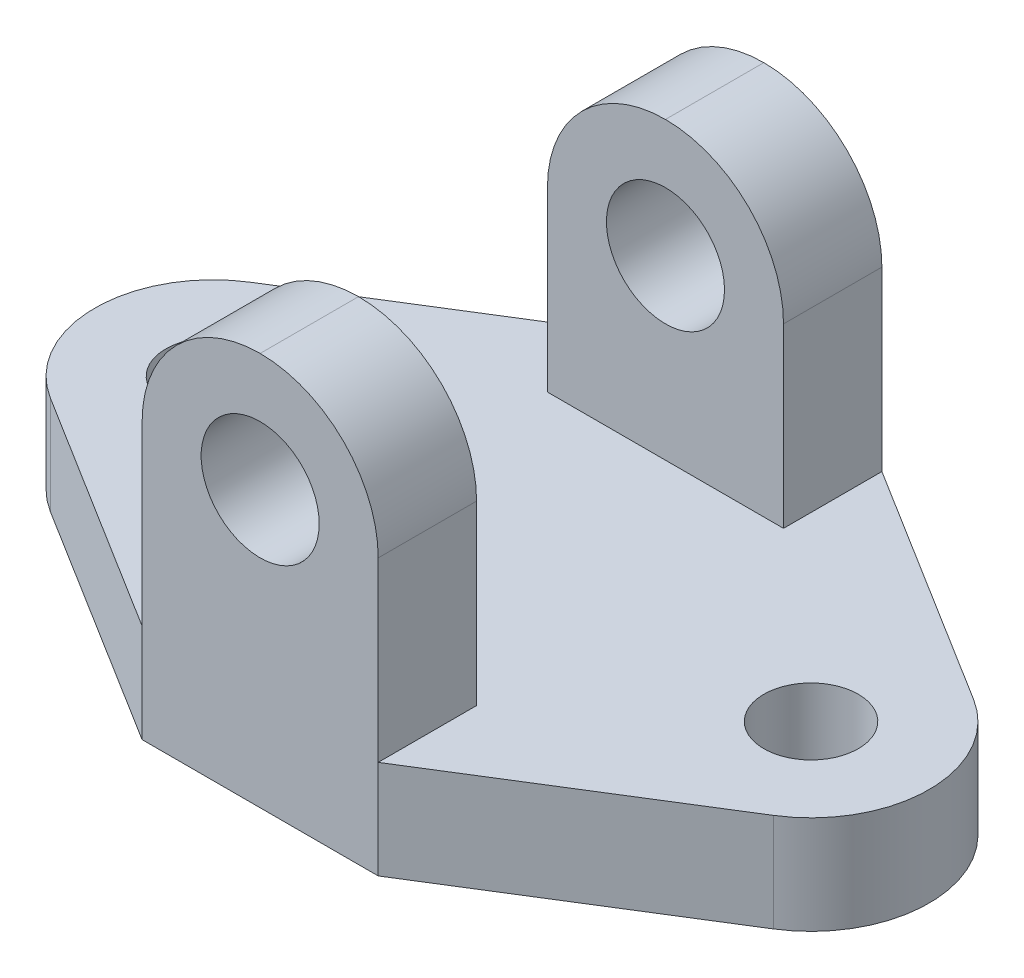
ISO-10303-21;
HEADER;
FILE_DESCRIPTION(('STEP AP214'),'2;1');
FILE_NAME('part.step','',(''),(''),'','','');
FILE_SCHEMA(('AUTOMOTIVE_DESIGN { 1 0 10303 214 1 1 1 1 }'));
ENDSEC;
DATA;
#1=APPLICATION_CONTEXT('core data for automotive mechanical design processes');
#2=APPLICATION_PROTOCOL_DEFINITION('international standard','automotive_design',2000,#1);
#3=PRODUCT_CONTEXT('',#1,'mechanical');
#4=PRODUCT('Part','Part','',(#3));
#5=PRODUCT_RELATED_PRODUCT_CATEGORY('part','',(#4));
#6=PRODUCT_DEFINITION_FORMATION('','',#4);
#7=PRODUCT_DEFINITION_CONTEXT('part definition',#1,'design');
#8=PRODUCT_DEFINITION('design','',#6,#7);
#9=PRODUCT_DEFINITION_SHAPE('','',#8);
#10=(LENGTH_UNIT() NAMED_UNIT(*) SI_UNIT(.MILLI.,.METRE.));
#11=(NAMED_UNIT(*) PLANE_ANGLE_UNIT() SI_UNIT($,.RADIAN.));
#12=(NAMED_UNIT(*) SI_UNIT($,.STERADIAN.) SOLID_ANGLE_UNIT());
#13=UNCERTAINTY_MEASURE_WITH_UNIT(LENGTH_MEASURE(1.E-05),#10,'distance_accuracy_value','');
#14=(GEOMETRIC_REPRESENTATION_CONTEXT(3) GLOBAL_UNCERTAINTY_ASSIGNED_CONTEXT((#13)) GLOBAL_UNIT_ASSIGNED_CONTEXT((#10,
#11,#12)) REPRESENTATION_CONTEXT('',''));
#15=CARTESIAN_POINT('',(0.,0.,0.));
#16=DIRECTION('',(0.,0.,1.));
#17=DIRECTION('',(1.,0.,0.));
#18=AXIS2_PLACEMENT_3D('',#15,#16,#17);
#19=CARTESIAN_POINT('',(-38.,12.5,0.));
#20=DIRECTION('',(0.,1.,0.));
#21=DIRECTION('',(0.,0.,1.));
#22=AXIS2_PLACEMENT_3D('',#19,#20,#21);
#23=PLANE('',#22);
#24=CARTESIAN_POINT('',(-38.,12.5,0.));
#25=DIRECTION('',(0.,1.,0.));
#26=DIRECTION('',(0.,0.,1.));
#27=AXIS2_PLACEMENT_3D('',#24,#25,#26);
#28=CIRCLE('',#27,5.99999999999999);
#29=CARTESIAN_POINT('',(-38.,12.5,5.99999999999999));
#30=VERTEX_POINT('',#29);
#31=EDGE_CURVE('E204',#30,#30,#28,.T.);
#32=ORIENTED_EDGE('',*,*,#31,.F.);
#33=EDGE_LOOP('',(#32));
#34=FACE_BOUND('',#33,.T.);
#35=CARTESIAN_POINT('',(38.,12.5,0.));
#36=DIRECTION('',(0.,1.,0.));
#37=DIRECTION('',(0.,0.,-1.));
#38=AXIS2_PLACEMENT_3D('',#35,#36,#37);
#39=CIRCLE('',#38,6.00000000000001);
#40=CARTESIAN_POINT('',(38.,12.5,-6.00000000000001));
#41=VERTEX_POINT('',#40);
#42=EDGE_CURVE('E198',#41,#41,#39,.T.);
#43=ORIENTED_EDGE('',*,*,#42,.F.);
#44=EDGE_LOOP('',(#43));
#45=FACE_BOUND('',#44,.T.);
#46=DIRECTION('',(-0.848782929350467,0.,-0.528741466922389));
#47=VECTOR('',#46,1.);
#48=CARTESIAN_POINT('',(45.9311220038358,12.5,-12.731743940257));
#49=LINE('',#48,#47);
#50=CARTESIAN_POINT('',(45.9311220038358,12.5,-12.731743940257));
#51=VERTEX_POINT('',#50);
#52=CARTESIAN_POINT('',(15.,12.5,-32.));
#53=VERTEX_POINT('',#52);
#54=EDGE_CURVE('E221',#51,#53,#49,.T.);
#55=ORIENTED_EDGE('',*,*,#54,.T.);
#56=DIRECTION('',(0.,0.,1.));
#57=VECTOR('',#56,1.);
#58=CARTESIAN_POINT('',(15.,12.5,0.));
#59=LINE('',#58,#57);
#60=CARTESIAN_POINT('',(15.,12.5,-19.5));
#61=VERTEX_POINT('',#60);
#62=EDGE_CURVE('E162',#53,#61,#59,.T.);
#63=ORIENTED_EDGE('',*,*,#62,.T.);
#64=DIRECTION('',(1.,0.,0.));
#65=VECTOR('',#64,1.);
#66=CARTESIAN_POINT('',(-38.,12.5,-19.5));
#67=LINE('',#66,#65);
#68=CARTESIAN_POINT('',(-15.,12.5,-19.5));
#69=VERTEX_POINT('',#68);
#70=EDGE_CURVE('E149',#69,#61,#67,.T.);
#71=ORIENTED_EDGE('',*,*,#70,.F.);
#72=DIRECTION('',(0.,0.,-1.));
#73=VECTOR('',#72,1.);
#74=CARTESIAN_POINT('',(-15.,12.5,0.));
#75=LINE('',#74,#73);
#76=CARTESIAN_POINT('',(-15.,12.5,-32.));
#77=VERTEX_POINT('',#76);
#78=EDGE_CURVE('E153',#69,#77,#75,.T.);
#79=ORIENTED_EDGE('',*,*,#78,.T.);
#80=DIRECTION('',(-0.848782929350467,0.,0.528741466922389));
#81=VECTOR('',#80,1.);
#82=CARTESIAN_POINT('',(-45.9311220038358,12.5,-12.731743940257));
#83=LINE('',#82,#81);
#84=CARTESIAN_POINT('',(-45.9311220038358,12.5,-12.731743940257));
#85=VERTEX_POINT('',#84);
#86=EDGE_CURVE('E223',#77,#85,#83,.T.);
#87=ORIENTED_EDGE('',*,*,#86,.T.);
#88=CARTESIAN_POINT('',(-38.,12.5,0.));
#89=DIRECTION('',(0.,1.,0.));
#90=DIRECTION('',(0.,0.,1.));
#91=AXIS2_PLACEMENT_3D('',#88,#89,#90);
#92=CIRCLE('',#91,15.);
#93=CARTESIAN_POINT('',(-45.9311220038358,12.5,12.731743940257));
#94=VERTEX_POINT('',#93);
#95=EDGE_CURVE('E210',#85,#94,#92,.T.);
#96=ORIENTED_EDGE('',*,*,#95,.T.);
#97=DIRECTION('',(0.848782929350467,0.,0.528741466922389));
#98=VECTOR('',#97,1.);
#99=CARTESIAN_POINT('',(-45.9311220038358,12.5,12.731743940257));
#100=LINE('',#99,#98);
#101=CARTESIAN_POINT('',(-15.,12.5,32.));
#102=VERTEX_POINT('',#101);
#103=EDGE_CURVE('E213',#94,#102,#100,.T.);
#104=ORIENTED_EDGE('',*,*,#103,.T.);
#105=DIRECTION('',(0.,0.,1.));
#106=VECTOR('',#105,1.);
#107=CARTESIAN_POINT('',(-15.,12.5,0.));
#108=LINE('',#107,#106);
#109=CARTESIAN_POINT('',(-15.,12.5,19.5));
#110=VERTEX_POINT('',#109);
#111=EDGE_CURVE('E191',#110,#102,#108,.T.);
#112=ORIENTED_EDGE('',*,*,#111,.F.);
#113=DIRECTION('',(-1.,0.,0.));
#114=VECTOR('',#113,1.);
#115=CARTESIAN_POINT('',(-38.,12.5,19.5));
#116=LINE('',#115,#114);
#117=CARTESIAN_POINT('',(15.,12.5,19.5));
#118=VERTEX_POINT('',#117);
#119=EDGE_CURVE('E194',#118,#110,#116,.T.);
#120=ORIENTED_EDGE('',*,*,#119,.F.);
#121=DIRECTION('',(0.,0.,-1.));
#122=VECTOR('',#121,1.);
#123=CARTESIAN_POINT('',(15.,12.5,0.));
#124=LINE('',#123,#122);
#125=CARTESIAN_POINT('',(15.,12.5,32.));
#126=VERTEX_POINT('',#125);
#127=EDGE_CURVE('E185',#126,#118,#124,.T.);
#128=ORIENTED_EDGE('',*,*,#127,.F.);
#129=DIRECTION('',(0.848782929350467,0.,-0.528741466922389));
#130=VECTOR('',#129,1.);
#131=CARTESIAN_POINT('',(45.9311220038358,12.5,12.731743940257));
#132=LINE('',#131,#130);
#133=CARTESIAN_POINT('',(45.9311220038358,12.5,12.731743940257));
#134=VERTEX_POINT('',#133);
#135=EDGE_CURVE('E217',#126,#134,#132,.T.);
#136=ORIENTED_EDGE('',*,*,#135,.T.);
#137=CARTESIAN_POINT('',(38.,12.5,0.));
#138=DIRECTION('',(0.,1.,0.));
#139=DIRECTION('',(0.,0.,-1.));
#140=AXIS2_PLACEMENT_3D('',#137,#138,#139);
#141=CIRCLE('',#140,15.);
#142=EDGE_CURVE('E219',#134,#51,#141,.T.);
#143=ORIENTED_EDGE('',*,*,#142,.T.);
#144=EDGE_LOOP('',(#55,#63,#71,#79,#87,#96,#104,#112,#120,#128,#136,#143));
#145=FACE_BOUND('',#144,.T.);
#146=ADVANCED_FACE('F37',(#34,#45,#145),#23,.T.);
#147=CARTESIAN_POINT('',(-38.,0.,0.));
#148=DIRECTION('',(0.,1.,0.));
#149=DIRECTION('',(0.,0.,1.));
#150=AXIS2_PLACEMENT_3D('',#147,#148,#149);
#151=PLANE('',#150);
#152=DIRECTION('',(-1.,0.,0.));
#153=VECTOR('',#152,1.);
#154=CARTESIAN_POINT('',(-15.,0.,-32.));
#155=LINE('',#154,#153);
#156=CARTESIAN_POINT('',(15.,0.,-32.));
#157=VERTEX_POINT('',#156);
#158=CARTESIAN_POINT('',(-15.,0.,-32.));
#159=VERTEX_POINT('',#158);
#160=EDGE_CURVE('E238',#157,#159,#155,.T.);
#161=ORIENTED_EDGE('',*,*,#160,.F.);
#162=DIRECTION('',(-0.848782929350467,0.,-0.528741466922389));
#163=VECTOR('',#162,1.);
#164=CARTESIAN_POINT('',(45.9311220038358,0.,-12.731743940257));
#165=LINE('',#164,#163);
#166=CARTESIAN_POINT('',(45.9311220038358,0.,-12.731743940257));
#167=VERTEX_POINT('',#166);
#168=EDGE_CURVE('E236',#167,#157,#165,.T.);
#169=ORIENTED_EDGE('',*,*,#168,.F.);
#170=CARTESIAN_POINT('',(38.,0.,0.));
#171=DIRECTION('',(0.,1.,0.));
#172=DIRECTION('',(0.,0.,-1.));
#173=AXIS2_PLACEMENT_3D('',#170,#171,#172);
#174=CIRCLE('',#173,15.);
#175=CARTESIAN_POINT('',(45.9311220038358,0.,12.731743940257));
#176=VERTEX_POINT('',#175);
#177=EDGE_CURVE('E234',#176,#167,#174,.T.);
#178=ORIENTED_EDGE('',*,*,#177,.F.);
#179=DIRECTION('',(0.848782929350467,0.,-0.528741466922389));
#180=VECTOR('',#179,1.);
#181=CARTESIAN_POINT('',(45.9311220038358,0.,12.731743940257));
#182=LINE('',#181,#180);
#183=CARTESIAN_POINT('',(15.,0.,32.));
#184=VERTEX_POINT('',#183);
#185=EDGE_CURVE('E232',#184,#176,#182,.T.);
#186=ORIENTED_EDGE('',*,*,#185,.F.);
#187=DIRECTION('',(1.,0.,0.));
#188=VECTOR('',#187,1.);
#189=CARTESIAN_POINT('',(-15.,0.,32.));
#190=LINE('',#189,#188);
#191=CARTESIAN_POINT('',(-15.,0.,32.));
#192=VERTEX_POINT('',#191);
#193=EDGE_CURVE('E230',#192,#184,#190,.T.);
#194=ORIENTED_EDGE('',*,*,#193,.F.);
#195=DIRECTION('',(0.848782929350467,0.,0.528741466922389));
#196=VECTOR('',#195,1.);
#197=CARTESIAN_POINT('',(-45.9311220038358,0.,12.731743940257));
#198=LINE('',#197,#196);
#199=CARTESIAN_POINT('',(-45.9311220038358,0.,12.731743940257));
#200=VERTEX_POINT('',#199);
#201=EDGE_CURVE('E228',#200,#192,#198,.T.);
#202=ORIENTED_EDGE('',*,*,#201,.F.);
#203=CARTESIAN_POINT('',(-38.,0.,0.));
#204=DIRECTION('',(0.,1.,0.));
#205=DIRECTION('',(0.,0.,1.));
#206=AXIS2_PLACEMENT_3D('',#203,#204,#205);
#207=CIRCLE('',#206,15.);
#208=CARTESIAN_POINT('',(-45.9311220038358,0.,-12.731743940257));
#209=VERTEX_POINT('',#208);
#210=EDGE_CURVE('E207',#209,#200,#207,.T.);
#211=ORIENTED_EDGE('',*,*,#210,.F.);
#212=DIRECTION('',(-0.848782929350467,0.,0.528741466922389));
#213=VECTOR('',#212,1.);
#214=CARTESIAN_POINT('',(-45.9311220038358,0.,-12.731743940257));
#215=LINE('',#214,#213);
#216=EDGE_CURVE('E214',#159,#209,#215,.T.);
#217=ORIENTED_EDGE('',*,*,#216,.F.);
#218=EDGE_LOOP('',(#161,#169,#178,#186,#194,#202,#211,#217));
#219=FACE_BOUND('',#218,.T.);
#220=CARTESIAN_POINT('',(38.,0.,0.));
#221=DIRECTION('',(0.,1.,0.));
#222=DIRECTION('',(0.,0.,-1.));
#223=AXIS2_PLACEMENT_3D('',#220,#221,#222);
#224=CIRCLE('',#223,6.00000000000001);
#225=CARTESIAN_POINT('',(38.,0.,-6.00000000000001));
#226=VERTEX_POINT('',#225);
#227=EDGE_CURVE('E197',#226,#226,#224,.T.);
#228=ORIENTED_EDGE('',*,*,#227,.T.);
#229=EDGE_LOOP('',(#228));
#230=FACE_BOUND('',#229,.T.);
#231=CARTESIAN_POINT('',(-38.,0.,0.));
#232=DIRECTION('',(0.,1.,0.));
#233=DIRECTION('',(0.,0.,1.));
#234=AXIS2_PLACEMENT_3D('',#231,#232,#233);
#235=CIRCLE('',#234,5.99999999999999);
#236=CARTESIAN_POINT('',(-38.,0.,5.99999999999999));
#237=VERTEX_POINT('',#236);
#238=EDGE_CURVE('E201',#237,#237,#235,.T.);
#239=ORIENTED_EDGE('',*,*,#238,.T.);
#240=EDGE_LOOP('',(#239));
#241=FACE_BOUND('',#240,.T.);
#242=ADVANCED_FACE('F365',(#219,#230,#241),#151,.F.);
#243=CARTESIAN_POINT('',(-38.,12.5,0.));
#244=DIRECTION('',(0.,-1.,0.));
#245=DIRECTION('',(0.,0.,-1.));
#246=AXIS2_PLACEMENT_3D('',#243,#244,#245);
#247=CYLINDRICAL_SURFACE('',#246,15.);
#248=ORIENTED_EDGE('',*,*,#210,.T.);
#249=DIRECTION('',(0.,-1.,0.));
#250=VECTOR('',#249,1.);
#251=CARTESIAN_POINT('',(-45.9311220038358,12.5,12.731743940257));
#252=LINE('',#251,#250);
#253=EDGE_CURVE('E261',#94,#200,#252,.T.);
#254=ORIENTED_EDGE('',*,*,#253,.F.);
#255=ORIENTED_EDGE('',*,*,#95,.F.);
#256=DIRECTION('',(0.,-1.,0.));
#257=VECTOR('',#256,1.);
#258=CARTESIAN_POINT('',(-45.9311220038358,12.5,-12.731743940257));
#259=LINE('',#258,#257);
#260=EDGE_CURVE('E225',#85,#209,#259,.T.);
#261=ORIENTED_EDGE('',*,*,#260,.T.);
#262=EDGE_LOOP('',(#248,#254,#255,#261));
#263=FACE_BOUND('',#262,.T.);
#264=ADVANCED_FACE('F324',(#263),#247,.T.);
#265=CARTESIAN_POINT('',(-45.9311220038358,12.5,12.731743940257));
#266=DIRECTION('',(0.528741466922389,0.,-0.848782929350467));
#267=DIRECTION('',(-0.848782929350467,0.,-0.528741466922389));
#268=AXIS2_PLACEMENT_3D('',#265,#266,#267);
#269=PLANE('',#268);
#270=ORIENTED_EDGE('',*,*,#201,.T.);
#271=DIRECTION('',(0.,-1.,0.));
#272=VECTOR('',#271,1.);
#273=CARTESIAN_POINT('',(-15.,12.5,32.));
#274=LINE('',#273,#272);
#275=EDGE_CURVE('E258',#102,#192,#274,.T.);
#276=ORIENTED_EDGE('',*,*,#275,.F.);
#277=ORIENTED_EDGE('',*,*,#103,.F.);
#278=ORIENTED_EDGE('',*,*,#253,.T.);
#279=EDGE_LOOP('',(#270,#276,#277,#278));
#280=FACE_BOUND('',#279,.T.);
#281=ADVANCED_FACE('F327',(#280),#269,.F.);
#282=CARTESIAN_POINT('',(-15.,12.5,32.));
#283=DIRECTION('',(0.,0.,-1.));
#284=DIRECTION('',(-1.,0.,0.));
#285=AXIS2_PLACEMENT_3D('',#282,#283,#284);
#286=PLANE('',#285);
#287=DIRECTION('',(0.,1.,0.));
#288=VECTOR('',#287,1.);
#289=CARTESIAN_POINT('',(15.,0.,32.));
#290=LINE('',#289,#288);
#291=CARTESIAN_POINT('',(15.,35.,32.));
#292=VERTEX_POINT('',#291);
#293=EDGE_CURVE('E176',#126,#292,#290,.T.);
#294=ORIENTED_EDGE('',*,*,#293,.T.);
#295=CARTESIAN_POINT('',(0.,35.,32.));
#296=DIRECTION('',(0.,0.,-1.));
#297=DIRECTION('',(-1.,0.,0.));
#298=AXIS2_PLACEMENT_3D('',#295,#296,#297);
#299=CIRCLE('',#298,15.);
#300=CARTESIAN_POINT('',(0.,50.,32.));
#301=VERTEX_POINT('',#300);
#302=EDGE_CURVE('E269',#292,#301,#299,.F.);
#303=ORIENTED_EDGE('',*,*,#302,.T.);
#304=CARTESIAN_POINT('',(0.,35.,32.));
#305=DIRECTION('',(0.,0.,-1.));
#306=DIRECTION('',(-1.,0.,0.));
#307=AXIS2_PLACEMENT_3D('',#304,#305,#306);
#308=CIRCLE('',#307,15.);
#309=CARTESIAN_POINT('',(-15.,35.,32.));
#310=VERTEX_POINT('',#309);
#311=EDGE_CURVE('E267',#301,#310,#308,.F.);
#312=ORIENTED_EDGE('',*,*,#311,.T.);
#313=DIRECTION('',(0.,-1.,0.));
#314=VECTOR('',#313,1.);
#315=CARTESIAN_POINT('',(-15.,0.,32.));
#316=LINE('',#315,#314);
#317=EDGE_CURVE('E183',#310,#102,#316,.T.);
#318=ORIENTED_EDGE('',*,*,#317,.T.);
#319=ORIENTED_EDGE('',*,*,#275,.T.);
#320=ORIENTED_EDGE('',*,*,#193,.T.);
#321=DIRECTION('',(0.,-1.,0.));
#322=VECTOR('',#321,1.);
#323=CARTESIAN_POINT('',(15.,12.5,32.));
#324=LINE('',#323,#322);
#325=EDGE_CURVE('E255',#126,#184,#324,.T.);
#326=ORIENTED_EDGE('',*,*,#325,.F.);
#327=EDGE_LOOP('',(#294,#303,#312,#318,#319,#320,#326));
#328=FACE_BOUND('',#327,.T.);
#329=CARTESIAN_POINT('',(0.,34.9999999999999,32.));
#330=DIRECTION('',(0.,0.,1.));
#331=DIRECTION('',(1.,0.,0.));
#332=AXIS2_PLACEMENT_3D('',#329,#330,#331);
#333=CIRCLE('',#332,7.5);
#334=CARTESIAN_POINT('',(7.5,34.9999999999999,32.));
#335=VERTEX_POINT('',#334);
#336=EDGE_CURVE('E169',#335,#335,#333,.T.);
#337=ORIENTED_EDGE('',*,*,#336,.F.);
#338=EDGE_LOOP('',(#337));
#339=FACE_BOUND('',#338,.T.);
#340=ADVANCED_FACE('F349',(#328,#339),#286,.F.);
#341=CARTESIAN_POINT('',(45.9311220038358,12.5,12.731743940257));
#342=DIRECTION('',(-0.528741466922389,0.,-0.848782929350467));
#343=DIRECTION('',(-0.848782929350467,0.,0.528741466922389));
#344=AXIS2_PLACEMENT_3D('',#341,#342,#343);
#345=PLANE('',#344);
#346=ORIENTED_EDGE('',*,*,#185,.T.);
#347=DIRECTION('',(0.,-1.,0.));
#348=VECTOR('',#347,1.);
#349=CARTESIAN_POINT('',(45.9311220038358,12.5,12.731743940257));
#350=LINE('',#349,#348);
#351=EDGE_CURVE('E252',#134,#176,#350,.T.);
#352=ORIENTED_EDGE('',*,*,#351,.F.);
#353=ORIENTED_EDGE('',*,*,#135,.F.);
#354=ORIENTED_EDGE('',*,*,#325,.T.);
#355=EDGE_LOOP('',(#346,#352,#353,#354));
#356=FACE_BOUND('',#355,.T.);
#357=ADVANCED_FACE('F390',(#356),#345,.F.);
#358=CARTESIAN_POINT('',(38.,12.5,0.));
#359=DIRECTION('',(0.,-1.,0.));
#360=DIRECTION('',(0.,0.,-1.));
#361=AXIS2_PLACEMENT_3D('',#358,#359,#360);
#362=CYLINDRICAL_SURFACE('',#361,15.);
#363=ORIENTED_EDGE('',*,*,#177,.T.);
#364=DIRECTION('',(0.,-1.,0.));
#365=VECTOR('',#364,1.);
#366=CARTESIAN_POINT('',(45.9311220038358,12.5,-12.731743940257));
#367=LINE('',#366,#365);
#368=EDGE_CURVE('E249',#51,#167,#367,.T.);
#369=ORIENTED_EDGE('',*,*,#368,.F.);
#370=ORIENTED_EDGE('',*,*,#142,.F.);
#371=ORIENTED_EDGE('',*,*,#351,.T.);
#372=EDGE_LOOP('',(#363,#369,#370,#371));
#373=FACE_BOUND('',#372,.T.);
#374=ADVANCED_FACE('F386',(#373),#362,.T.);
#375=CARTESIAN_POINT('',(45.9311220038358,12.5,-12.731743940257));
#376=DIRECTION('',(-0.528741466922389,0.,0.848782929350467));
#377=DIRECTION('',(0.848782929350467,0.,0.528741466922389));
#378=AXIS2_PLACEMENT_3D('',#375,#376,#377);
#379=PLANE('',#378);
#380=ORIENTED_EDGE('',*,*,#168,.T.);
#381=DIRECTION('',(0.,-1.,0.));
#382=VECTOR('',#381,1.);
#383=CARTESIAN_POINT('',(15.,12.5,-32.));
#384=LINE('',#383,#382);
#385=EDGE_CURVE('E246',#53,#157,#384,.T.);
#386=ORIENTED_EDGE('',*,*,#385,.F.);
#387=ORIENTED_EDGE('',*,*,#54,.F.);
#388=ORIENTED_EDGE('',*,*,#368,.T.);
#389=EDGE_LOOP('',(#380,#386,#387,#388));
#390=FACE_BOUND('',#389,.T.);
#391=ADVANCED_FACE('F383',(#390),#379,.F.);
#392=CARTESIAN_POINT('',(-15.,12.5,-32.));
#393=DIRECTION('',(0.,0.,1.));
#394=DIRECTION('',(1.,0.,0.));
#395=AXIS2_PLACEMENT_3D('',#392,#393,#394);
#396=PLANE('',#395);
#397=CARTESIAN_POINT('',(0.,35.,-32.));
#398=DIRECTION('',(0.,0.,1.));
#399=DIRECTION('',(1.,0.,0.));
#400=AXIS2_PLACEMENT_3D('',#397,#398,#399);
#401=CIRCLE('',#400,15.);
#402=CARTESIAN_POINT('',(-15.,35.,-32.));
#403=VERTEX_POINT('',#402);
#404=CARTESIAN_POINT('',(0.,50.,-32.));
#405=VERTEX_POINT('',#404);
#406=EDGE_CURVE('E276',#403,#405,#401,.F.);
#407=ORIENTED_EDGE('',*,*,#406,.T.);
#408=CARTESIAN_POINT('',(0.,35.,-32.));
#409=DIRECTION('',(0.,0.,1.));
#410=DIRECTION('',(1.,0.,0.));
#411=AXIS2_PLACEMENT_3D('',#408,#409,#410);
#412=CIRCLE('',#411,15.);
#413=CARTESIAN_POINT('',(15.,35.,-32.));
#414=VERTEX_POINT('',#413);
#415=EDGE_CURVE('E279',#405,#414,#412,.F.);
#416=ORIENTED_EDGE('',*,*,#415,.T.);
#417=DIRECTION('',(0.,1.,0.));
#418=VECTOR('',#417,1.);
#419=CARTESIAN_POINT('',(15.,0.,-32.));
#420=LINE('',#419,#418);
#421=EDGE_CURVE('E290',#53,#414,#420,.T.);
#422=ORIENTED_EDGE('',*,*,#421,.F.);
#423=ORIENTED_EDGE('',*,*,#385,.T.);
#424=ORIENTED_EDGE('',*,*,#160,.T.);
#425=DIRECTION('',(0.,-1.,0.));
#426=VECTOR('',#425,1.);
#427=CARTESIAN_POINT('',(-15.,12.5,-32.));
#428=LINE('',#427,#426);
#429=EDGE_CURVE('E243',#77,#159,#428,.T.);
#430=ORIENTED_EDGE('',*,*,#429,.F.);
#431=DIRECTION('',(0.,-1.,0.));
#432=VECTOR('',#431,1.);
#433=CARTESIAN_POINT('',(-15.,0.,-32.));
#434=LINE('',#433,#432);
#435=EDGE_CURVE('E159',#403,#77,#434,.T.);
#436=ORIENTED_EDGE('',*,*,#435,.F.);
#437=EDGE_LOOP('',(#407,#416,#422,#423,#424,#430,#436));
#438=FACE_BOUND('',#437,.T.);
#439=CARTESIAN_POINT('',(0.,34.9999999999999,-32.));
#440=DIRECTION('',(0.,0.,1.));
#441=DIRECTION('',(1.,0.,0.));
#442=AXIS2_PLACEMENT_3D('',#439,#440,#441);
#443=CIRCLE('',#442,7.5);
#444=CARTESIAN_POINT('',(7.5,34.9999999999999,-32.));
#445=VERTEX_POINT('',#444);
#446=EDGE_CURVE('E296',#445,#445,#443,.T.);
#447=ORIENTED_EDGE('',*,*,#446,.T.);
#448=EDGE_LOOP('',(#447));
#449=FACE_BOUND('',#448,.T.);
#450=ADVANCED_FACE('F312',(#438,#449),#396,.F.);
#451=CARTESIAN_POINT('',(-45.9311220038358,12.5,-12.731743940257));
#452=DIRECTION('',(0.528741466922389,0.,0.848782929350467));
#453=DIRECTION('',(0.848782929350467,0.,-0.528741466922389));
#454=AXIS2_PLACEMENT_3D('',#451,#452,#453);
#455=PLANE('',#454);
#456=ORIENTED_EDGE('',*,*,#216,.T.);
#457=ORIENTED_EDGE('',*,*,#260,.F.);
#458=ORIENTED_EDGE('',*,*,#86,.F.);
#459=ORIENTED_EDGE('',*,*,#429,.T.);
#460=EDGE_LOOP('',(#456,#457,#458,#459));
#461=FACE_BOUND('',#460,.T.);
#462=ADVANCED_FACE('F318',(#461),#455,.F.);
#463=CARTESIAN_POINT('',(-38.,12.5,0.));
#464=DIRECTION('',(0.,-1.,0.));
#465=DIRECTION('',(0.,0.,-1.));
#466=AXIS2_PLACEMENT_3D('',#463,#464,#465);
#467=CYLINDRICAL_SURFACE('',#466,5.99999999999999);
#468=ORIENTED_EDGE('',*,*,#31,.T.);
#469=EDGE_LOOP('',(#468));
#470=FACE_BOUND('',#469,.T.);
#471=ORIENTED_EDGE('',*,*,#238,.F.);
#472=EDGE_LOOP('',(#471));
#473=FACE_BOUND('',#472,.T.);
#474=ADVANCED_FACE('F376',(#470,#473),#467,.F.);
#475=CARTESIAN_POINT('',(38.,12.5,0.));
#476=DIRECTION('',(0.,-1.,0.));
#477=DIRECTION('',(0.,0.,-1.));
#478=AXIS2_PLACEMENT_3D('',#475,#476,#477);
#479=CYLINDRICAL_SURFACE('',#478,6.00000000000001);
#480=ORIENTED_EDGE('',*,*,#42,.T.);
#481=EDGE_LOOP('',(#480));
#482=FACE_BOUND('',#481,.T.);
#483=ORIENTED_EDGE('',*,*,#227,.F.);
#484=EDGE_LOOP('',(#483));
#485=FACE_BOUND('',#484,.T.);
#486=ADVANCED_FACE('F442',(#482,#485),#479,.F.);
#487=CARTESIAN_POINT('',(15.,0.,19.5));
#488=DIRECTION('',(1.,0.,0.));
#489=DIRECTION('',(0.,1.,0.));
#490=AXIS2_PLACEMENT_3D('',#487,#488,#489);
#491=PLANE('',#490);
#492=DIRECTION('',(0.,1.,0.));
#493=VECTOR('',#492,1.);
#494=CARTESIAN_POINT('',(15.,0.,19.5));
#495=LINE('',#494,#493);
#496=CARTESIAN_POINT('',(15.,35.,19.5));
#497=VERTEX_POINT('',#496);
#498=EDGE_CURVE('E179',#118,#497,#495,.T.);
#499=ORIENTED_EDGE('',*,*,#498,.T.);
#500=DIRECTION('',(0.,0.,1.));
#501=VECTOR('',#500,1.);
#502=CARTESIAN_POINT('',(15.,35.,19.5));
#503=LINE('',#502,#501);
#504=EDGE_CURVE('E264',#497,#292,#503,.T.);
#505=ORIENTED_EDGE('',*,*,#504,.T.);
#506=ORIENTED_EDGE('',*,*,#293,.F.);
#507=ORIENTED_EDGE('',*,*,#127,.T.);
#508=EDGE_LOOP('',(#499,#505,#506,#507));
#509=FACE_BOUND('',#508,.T.);
#510=ADVANCED_FACE('F343',(#509),#491,.T.);
#511=CARTESIAN_POINT('',(-15.,0.,19.5));
#512=DIRECTION('',(-1.,0.,0.));
#513=DIRECTION('',(0.,-1.,0.));
#514=AXIS2_PLACEMENT_3D('',#511,#512,#513);
#515=PLANE('',#514);
#516=ORIENTED_EDGE('',*,*,#317,.F.);
#517=DIRECTION('',(0.,0.,1.));
#518=VECTOR('',#517,1.);
#519=CARTESIAN_POINT('',(-15.,35.,19.5));
#520=LINE('',#519,#518);
#521=CARTESIAN_POINT('',(-15.,35.,19.5));
#522=VERTEX_POINT('',#521);
#523=EDGE_CURVE('E275',#310,#522,#520,.F.);
#524=ORIENTED_EDGE('',*,*,#523,.T.);
#525=DIRECTION('',(0.,-1.,0.));
#526=VECTOR('',#525,1.);
#527=CARTESIAN_POINT('',(-15.,0.,19.5));
#528=LINE('',#527,#526);
#529=EDGE_CURVE('E182',#522,#110,#528,.T.);
#530=ORIENTED_EDGE('',*,*,#529,.T.);
#531=ORIENTED_EDGE('',*,*,#111,.T.);
#532=EDGE_LOOP('',(#516,#524,#530,#531));
#533=FACE_BOUND('',#532,.T.);
#534=ADVANCED_FACE('F332',(#533),#515,.T.);
#535=CARTESIAN_POINT('',(0.,0.,19.5));
#536=DIRECTION('',(0.,0.,-1.));
#537=DIRECTION('',(-1.,0.,0.));
#538=AXIS2_PLACEMENT_3D('',#535,#536,#537);
#539=PLANE('',#538);
#540=CARTESIAN_POINT('',(0.,34.9999999999999,19.5));
#541=DIRECTION('',(0.,0.,1.));
#542=DIRECTION('',(1.,0.,0.));
#543=AXIS2_PLACEMENT_3D('',#540,#541,#542);
#544=CIRCLE('',#543,7.5);
#545=CARTESIAN_POINT('',(7.5,34.9999999999999,19.5));
#546=VERTEX_POINT('',#545);
#547=EDGE_CURVE('E173',#546,#546,#544,.T.);
#548=ORIENTED_EDGE('',*,*,#547,.T.);
#549=EDGE_LOOP('',(#548));
#550=FACE_BOUND('',#549,.T.);
#551=CARTESIAN_POINT('',(0.,35.,19.5));
#552=DIRECTION('',(0.,0.,-1.));
#553=DIRECTION('',(-1.,0.,0.));
#554=AXIS2_PLACEMENT_3D('',#551,#552,#553);
#555=CIRCLE('',#554,15.);
#556=CARTESIAN_POINT('',(0.,50.,19.5));
#557=VERTEX_POINT('',#556);
#558=EDGE_CURVE('E271',#522,#557,#555,.T.);
#559=ORIENTED_EDGE('',*,*,#558,.T.);
#560=CARTESIAN_POINT('',(0.,35.,19.5));
#561=DIRECTION('',(0.,0.,-1.));
#562=DIRECTION('',(-1.,0.,0.));
#563=AXIS2_PLACEMENT_3D('',#560,#561,#562);
#564=CIRCLE('',#563,15.);
#565=EDGE_CURVE('E273',#557,#497,#564,.T.);
#566=ORIENTED_EDGE('',*,*,#565,.T.);
#567=ORIENTED_EDGE('',*,*,#498,.F.);
#568=ORIENTED_EDGE('',*,*,#119,.T.);
#569=ORIENTED_EDGE('',*,*,#529,.F.);
#570=EDGE_LOOP('',(#559,#566,#567,#568,#569));
#571=FACE_BOUND('',#570,.T.);
#572=ADVANCED_FACE('F338',(#550,#571),#539,.T.);
#573=CARTESIAN_POINT('',(0.,34.9999999999999,19.5));
#574=DIRECTION('',(0.,0.,1.));
#575=DIRECTION('',(1.,0.,0.));
#576=AXIS2_PLACEMENT_3D('',#573,#574,#575);
#577=CYLINDRICAL_SURFACE('',#576,7.5);
#578=ORIENTED_EDGE('',*,*,#547,.F.);
#579=EDGE_LOOP('',(#578));
#580=FACE_BOUND('',#579,.T.);
#581=ORIENTED_EDGE('',*,*,#336,.T.);
#582=EDGE_LOOP('',(#581));
#583=FACE_BOUND('',#582,.T.);
#584=ADVANCED_FACE('F355',(#580,#583),#577,.F.);
#585=CARTESIAN_POINT('',(0.,35.,19.5));
#586=DIRECTION('',(0.,0.,1.));
#587=DIRECTION('',(1.,0.,0.));
#588=AXIS2_PLACEMENT_3D('',#585,#586,#587);
#589=CYLINDRICAL_SURFACE('',#588,15.);
#590=DIRECTION('',(0.,0.,1.));
#591=VECTOR('',#590,1.);
#592=CARTESIAN_POINT('',(0.,50.,19.5));
#593=LINE('',#592,#591);
#594=EDGE_CURVE('E166',#557,#301,#593,.T.);
#595=ORIENTED_EDGE('',*,*,#594,.F.);
#596=ORIENTED_EDGE('',*,*,#558,.F.);
#597=ORIENTED_EDGE('',*,*,#523,.F.);
#598=ORIENTED_EDGE('',*,*,#311,.F.);
#599=EDGE_LOOP('',(#595,#596,#597,#598));
#600=FACE_BOUND('',#599,.T.);
#601=ADVANCED_FACE('F353',(#600),#589,.T.);
#602=CARTESIAN_POINT('',(0.,35.,19.5));
#603=DIRECTION('',(0.,0.,1.));
#604=DIRECTION('',(1.,0.,0.));
#605=AXIS2_PLACEMENT_3D('',#602,#603,#604);
#606=CYLINDRICAL_SURFACE('',#605,15.);
#607=ORIENTED_EDGE('',*,*,#565,.F.);
#608=ORIENTED_EDGE('',*,*,#594,.T.);
#609=ORIENTED_EDGE('',*,*,#302,.F.);
#610=ORIENTED_EDGE('',*,*,#504,.F.);
#611=EDGE_LOOP('',(#607,#608,#609,#610));
#612=FACE_BOUND('',#611,.T.);
#613=ADVANCED_FACE('F346',(#612),#606,.T.);
#614=CARTESIAN_POINT('',(0.,0.,-19.5));
#615=DIRECTION('',(0.,0.,1.));
#616=DIRECTION('',(-1.,0.,0.));
#617=AXIS2_PLACEMENT_3D('',#614,#615,#616);
#618=PLANE('',#617);
#619=DIRECTION('',(0.,1.,0.));
#620=VECTOR('',#619,1.);
#621=CARTESIAN_POINT('',(15.,0.,-19.5));
#622=LINE('',#621,#620);
#623=CARTESIAN_POINT('',(15.,35.,-19.5));
#624=VERTEX_POINT('',#623);
#625=EDGE_CURVE('E154',#61,#624,#622,.T.);
#626=ORIENTED_EDGE('',*,*,#625,.T.);
#627=CARTESIAN_POINT('',(0.,35.,-19.5));
#628=DIRECTION('',(0.,0.,1.));
#629=DIRECTION('',(1.,0.,0.));
#630=AXIS2_PLACEMENT_3D('',#627,#628,#629);
#631=CIRCLE('',#630,15.);
#632=CARTESIAN_POINT('',(0.,50.,-19.5));
#633=VERTEX_POINT('',#632);
#634=EDGE_CURVE('E46',#624,#633,#631,.T.);
#635=ORIENTED_EDGE('',*,*,#634,.T.);
#636=CARTESIAN_POINT('',(0.,35.,-19.5));
#637=DIRECTION('',(0.,0.,1.));
#638=DIRECTION('',(1.,0.,0.));
#639=AXIS2_PLACEMENT_3D('',#636,#637,#638);
#640=CIRCLE('',#639,15.);
#641=CARTESIAN_POINT('',(-15.,35.,-19.5));
#642=VERTEX_POINT('',#641);
#643=EDGE_CURVE('E56',#633,#642,#640,.T.);
#644=ORIENTED_EDGE('',*,*,#643,.T.);
#645=DIRECTION('',(0.,-1.,0.));
#646=VECTOR('',#645,1.);
#647=CARTESIAN_POINT('',(-15.,0.,-19.5));
#648=LINE('',#647,#646);
#649=EDGE_CURVE('E144',#642,#69,#648,.T.);
#650=ORIENTED_EDGE('',*,*,#649,.T.);
#651=ORIENTED_EDGE('',*,*,#70,.T.);
#652=EDGE_LOOP('',(#626,#635,#644,#650,#651));
#653=FACE_BOUND('',#652,.T.);
#654=CARTESIAN_POINT('',(0.,34.9999999999999,-19.5));
#655=DIRECTION('',(0.,0.,1.));
#656=DIRECTION('',(1.,0.,0.));
#657=AXIS2_PLACEMENT_3D('',#654,#655,#656);
#658=CIRCLE('',#657,7.5);
#659=CARTESIAN_POINT('',(7.5,34.9999999999999,-19.5));
#660=VERTEX_POINT('',#659);
#661=EDGE_CURVE('E299',#660,#660,#658,.T.);
#662=ORIENTED_EDGE('',*,*,#661,.F.);
#663=EDGE_LOOP('',(#662));
#664=FACE_BOUND('',#663,.T.);
#665=ADVANCED_FACE('F146',(#653,#664),#618,.T.);
#666=CARTESIAN_POINT('',(15.,0.,-19.5));
#667=DIRECTION('',(-1.,0.,0.));
#668=DIRECTION('',(0.,-1.,0.));
#669=AXIS2_PLACEMENT_3D('',#666,#667,#668);
#670=PLANE('',#669);
#671=ORIENTED_EDGE('',*,*,#421,.T.);
#672=DIRECTION('',(0.,0.,-1.));
#673=VECTOR('',#672,1.);
#674=CARTESIAN_POINT('',(15.,35.,-19.5));
#675=LINE('',#674,#673);
#676=EDGE_CURVE('E281',#414,#624,#675,.F.);
#677=ORIENTED_EDGE('',*,*,#676,.T.);
#678=ORIENTED_EDGE('',*,*,#625,.F.);
#679=ORIENTED_EDGE('',*,*,#62,.F.);
#680=EDGE_LOOP('',(#671,#677,#678,#679));
#681=FACE_BOUND('',#680,.T.);
#682=ADVANCED_FACE('F288',(#681),#670,.F.);
#683=CARTESIAN_POINT('',(-15.,0.,-19.5));
#684=DIRECTION('',(1.,0.,0.));
#685=DIRECTION('',(0.,1.,0.));
#686=AXIS2_PLACEMENT_3D('',#683,#684,#685);
#687=PLANE('',#686);
#688=ORIENTED_EDGE('',*,*,#649,.F.);
#689=DIRECTION('',(0.,0.,-1.));
#690=VECTOR('',#689,1.);
#691=CARTESIAN_POINT('',(-15.,35.,-19.5));
#692=LINE('',#691,#690);
#693=EDGE_CURVE('E11',#642,#403,#692,.T.);
#694=ORIENTED_EDGE('',*,*,#693,.T.);
#695=ORIENTED_EDGE('',*,*,#435,.T.);
#696=ORIENTED_EDGE('',*,*,#78,.F.);
#697=EDGE_LOOP('',(#688,#694,#695,#696));
#698=FACE_BOUND('',#697,.T.);
#699=ADVANCED_FACE('F157',(#698),#687,.F.);
#700=CARTESIAN_POINT('',(0.,34.9999999999999,-19.5));
#701=DIRECTION('',(0.,0.,-1.));
#702=DIRECTION('',(-1.,0.,0.));
#703=AXIS2_PLACEMENT_3D('',#700,#701,#702);
#704=CYLINDRICAL_SURFACE('',#703,7.5);
#705=ORIENTED_EDGE('',*,*,#661,.T.);
#706=EDGE_LOOP('',(#705));
#707=FACE_BOUND('',#706,.T.);
#708=ORIENTED_EDGE('',*,*,#446,.F.);
#709=EDGE_LOOP('',(#708));
#710=FACE_BOUND('',#709,.T.);
#711=ADVANCED_FACE('F512',(#707,#710),#704,.F.);
#712=CARTESIAN_POINT('',(0.,35.,-19.5));
#713=DIRECTION('',(0.,0.,-1.));
#714=DIRECTION('',(-1.,0.,0.));
#715=AXIS2_PLACEMENT_3D('',#712,#713,#714);
#716=CYLINDRICAL_SURFACE('',#715,15.);
#717=ORIENTED_EDGE('',*,*,#693,.F.);
#718=ORIENTED_EDGE('',*,*,#643,.F.);
#719=DIRECTION('',(0.,0.,-1.));
#720=VECTOR('',#719,1.);
#721=CARTESIAN_POINT('',(0.,50.,-19.5));
#722=LINE('',#721,#720);
#723=EDGE_CURVE('E41',#405,#633,#722,.F.);
#724=ORIENTED_EDGE('',*,*,#723,.F.);
#725=ORIENTED_EDGE('',*,*,#406,.F.);
#726=EDGE_LOOP('',(#717,#718,#724,#725));
#727=FACE_BOUND('',#726,.T.);
#728=ADVANCED_FACE('F39',(#727),#716,.T.);
#729=CARTESIAN_POINT('',(0.,35.,-19.5));
#730=DIRECTION('',(0.,0.,-1.));
#731=DIRECTION('',(-1.,0.,0.));
#732=AXIS2_PLACEMENT_3D('',#729,#730,#731);
#733=CYLINDRICAL_SURFACE('',#732,15.);
#734=ORIENTED_EDGE('',*,*,#634,.F.);
#735=ORIENTED_EDGE('',*,*,#676,.F.);
#736=ORIENTED_EDGE('',*,*,#415,.F.);
#737=ORIENTED_EDGE('',*,*,#723,.T.);
#738=EDGE_LOOP('',(#734,#735,#736,#737));
#739=FACE_BOUND('',#738,.T.);
#740=ADVANCED_FACE('F308',(#739),#733,.T.);
#741=CLOSED_SHELL('',(#146,#242,#264,#281,#340,#357,#374,#391,#450,#462,#474,#486,#510,#534,
#572,#584,#601,#613,#665,#682,#699,#711,#728,#740));
#742=MANIFOLD_SOLID_BREP('B2',#741);
#743=ADVANCED_BREP_SHAPE_REPRESENTATION('',(#18,#742),#14);
#744=SHAPE_DEFINITION_REPRESENTATION(#9,#743);
ENDSEC;
END-ISO-10303-21;
